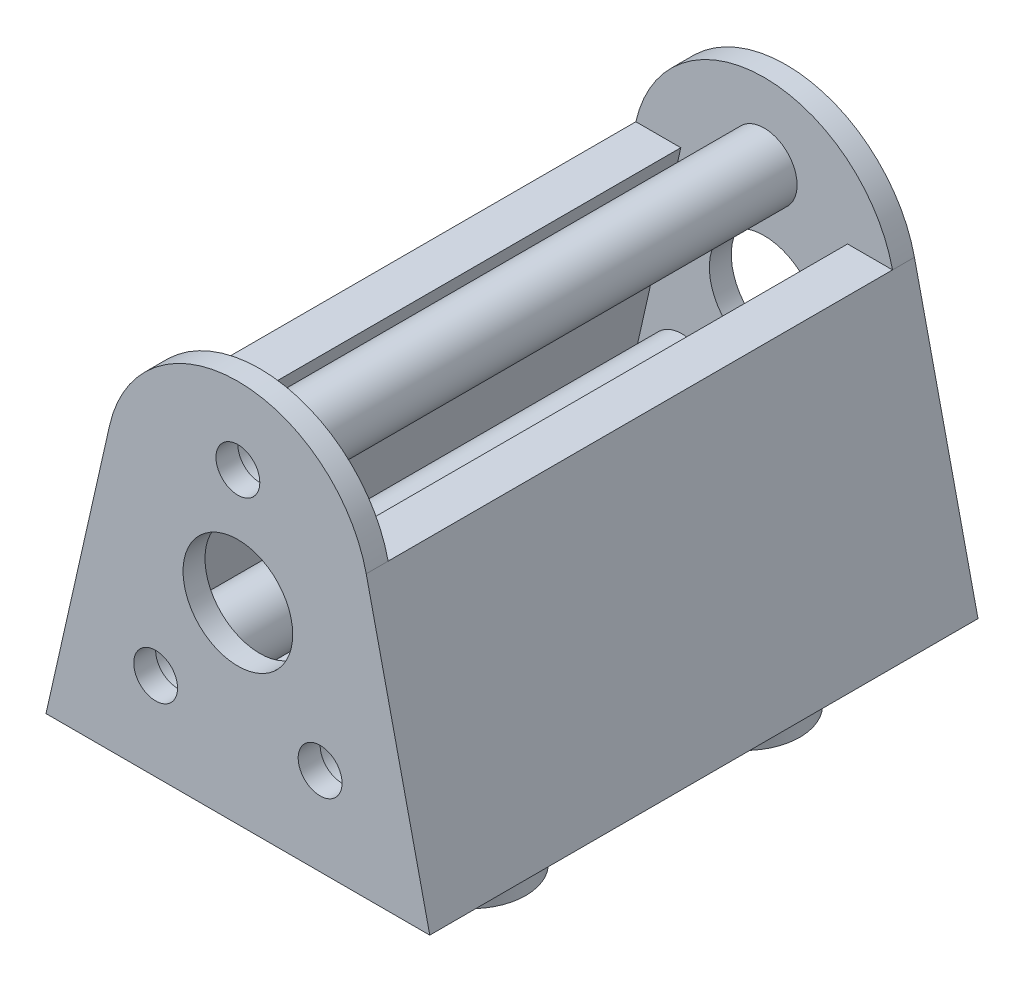
ISO-10303-21;
HEADER;
FILE_DESCRIPTION(('STEP AP214'),'2;1');
FILE_NAME('part.step','',(''),(''),'','','');
FILE_SCHEMA(('AUTOMOTIVE_DESIGN { 1 0 10303 214 1 1 1 1 }'));
ENDSEC;
DATA;
#1=APPLICATION_CONTEXT('core data for automotive mechanical design processes');
#2=APPLICATION_PROTOCOL_DEFINITION('international standard','automotive_design',2000,#1);
#3=PRODUCT_CONTEXT('',#1,'mechanical');
#4=PRODUCT('Part','Part','',(#3));
#5=PRODUCT_RELATED_PRODUCT_CATEGORY('part','',(#4));
#6=PRODUCT_DEFINITION_FORMATION('','',#4);
#7=PRODUCT_DEFINITION_CONTEXT('part definition',#1,'design');
#8=PRODUCT_DEFINITION('design','',#6,#7);
#9=PRODUCT_DEFINITION_SHAPE('','',#8);
#10=(LENGTH_UNIT() NAMED_UNIT(*) SI_UNIT(.MILLI.,.METRE.));
#11=(NAMED_UNIT(*) PLANE_ANGLE_UNIT() SI_UNIT($,.RADIAN.));
#12=(NAMED_UNIT(*) SI_UNIT($,.STERADIAN.) SOLID_ANGLE_UNIT());
#13=UNCERTAINTY_MEASURE_WITH_UNIT(LENGTH_MEASURE(1.E-05),#10,'distance_accuracy_value','');
#14=(GEOMETRIC_REPRESENTATION_CONTEXT(3) GLOBAL_UNCERTAINTY_ASSIGNED_CONTEXT((#13)) GLOBAL_UNIT_ASSIGNED_CONTEXT((#10,
#11,#12)) REPRESENTATION_CONTEXT('',''));
#15=CARTESIAN_POINT('',(0.,0.,0.));
#16=DIRECTION('',(0.,0.,1.));
#17=DIRECTION('',(1.,0.,0.));
#18=AXIS2_PLACEMENT_3D('',#15,#16,#17);
#19=CARTESIAN_POINT('',(0.,0.,0.));
#20=DIRECTION('',(0.,0.,1.));
#21=DIRECTION('',(1.,0.,0.));
#22=AXIS2_PLACEMENT_3D('',#19,#20,#21);
#23=PLANE('',#22);
#24=CARTESIAN_POINT('',(7.5,8.,0.));
#25=DIRECTION('',(0.,0.,1.));
#26=DIRECTION('',(1.,0.,0.));
#27=AXIS2_PLACEMENT_3D('',#24,#25,#26);
#28=CIRCLE('',#27,2.);
#29=CARTESIAN_POINT('',(9.5,8.,0.));
#30=VERTEX_POINT('',#29);
#31=EDGE_CURVE('E134',#30,#30,#28,.T.);
#32=ORIENTED_EDGE('',*,*,#31,.T.);
#33=EDGE_LOOP('',(#32));
#34=FACE_BOUND('',#33,.T.);
#35=CARTESIAN_POINT('',(7.5,8.,0.));
#36=DIRECTION('',(0.,0.,-1.));
#37=DIRECTION('',(1.,0.,0.));
#38=AXIS2_PLACEMENT_3D('',#35,#36,#37);
#39=CIRCLE('',#38,2.5);
#40=CARTESIAN_POINT('',(10.,8.,0.));
#41=VERTEX_POINT('',#40);
#42=EDGE_CURVE('E178',#41,#41,#39,.T.);
#43=ORIENTED_EDGE('',*,*,#42,.T.);
#44=EDGE_LOOP('',(#43));
#45=FACE_BOUND('',#44,.T.);
#46=ADVANCED_FACE('F48',(#34,#45),#23,.F.);
#47=CARTESIAN_POINT('',(0.,23.,-46.));
#48=DIRECTION('',(0.,0.,1.));
#49=DIRECTION('',(1.,0.,0.));
#50=AXIS2_PLACEMENT_3D('',#47,#48,#49);
#51=PLANE('',#50);
#52=CARTESIAN_POINT('',(7.5,8.,-46.));
#53=DIRECTION('',(0.,0.,1.));
#54=DIRECTION('',(1.,0.,0.));
#55=AXIS2_PLACEMENT_3D('',#52,#53,#54);
#56=CIRCLE('',#55,2.);
#57=CARTESIAN_POINT('',(9.5,8.,-46.));
#58=VERTEX_POINT('',#57);
#59=EDGE_CURVE('E203',#58,#58,#56,.T.);
#60=ORIENTED_EDGE('',*,*,#59,.F.);
#61=EDGE_LOOP('',(#60));
#62=FACE_BOUND('',#61,.T.);
#63=CARTESIAN_POINT('',(7.5,8.,-46.));
#64=DIRECTION('',(0.,0.,1.));
#65=DIRECTION('',(1.,0.,0.));
#66=AXIS2_PLACEMENT_3D('',#63,#64,#65);
#67=CIRCLE('',#66,2.5);
#68=CARTESIAN_POINT('',(10.,8.,-46.));
#69=VERTEX_POINT('',#68);
#70=EDGE_CURVE('E282',#69,#69,#67,.F.);
#71=ORIENTED_EDGE('',*,*,#70,.F.);
#72=EDGE_LOOP('',(#71));
#73=FACE_BOUND('',#72,.T.);
#74=ADVANCED_FACE('F360',(#62,#73),#51,.T.);
#75=CARTESIAN_POINT('',(0.,28.,0.));
#76=DIRECTION('',(0.,0.,1.));
#77=DIRECTION('',(1.,0.,0.));
#78=AXIS2_PLACEMENT_3D('',#75,#76,#77);
#79=CIRCLE('',#78,2.);
#80=CARTESIAN_POINT('',(2.,28.,0.));
#81=VERTEX_POINT('',#80);
#82=EDGE_CURVE('E265',#81,#81,#79,.T.);
#83=ORIENTED_EDGE('',*,*,#82,.T.);
#84=EDGE_LOOP('',(#83));
#85=FACE_BOUND('',#84,.T.);
#86=CARTESIAN_POINT('',(0.,28.,0.));
#87=DIRECTION('',(0.,0.,-1.));
#88=DIRECTION('',(-1.,0.,0.));
#89=AXIS2_PLACEMENT_3D('',#86,#87,#88);
#90=CIRCLE('',#89,2.5);
#91=CARTESIAN_POINT('',(-2.5,28.,0.));
#92=VERTEX_POINT('',#91);
#93=EDGE_CURVE('E184',#92,#92,#90,.T.);
#94=ORIENTED_EDGE('',*,*,#93,.T.);
#95=EDGE_LOOP('',(#94));
#96=FACE_BOUND('',#95,.T.);
#97=ADVANCED_FACE('F395',(#85,#96),#23,.F.);
#98=CARTESIAN_POINT('',(0.,28.,-46.));
#99=DIRECTION('',(0.,0.,1.));
#100=DIRECTION('',(1.,0.,0.));
#101=AXIS2_PLACEMENT_3D('',#98,#99,#100);
#102=CIRCLE('',#101,2.);
#103=CARTESIAN_POINT('',(2.,28.,-46.));
#104=VERTEX_POINT('',#103);
#105=EDGE_CURVE('E191',#104,#104,#102,.T.);
#106=ORIENTED_EDGE('',*,*,#105,.F.);
#107=EDGE_LOOP('',(#106));
#108=FACE_BOUND('',#107,.T.);
#109=CARTESIAN_POINT('',(0.,28.,-46.));
#110=DIRECTION('',(0.,0.,1.));
#111=DIRECTION('',(1.,0.,0.));
#112=AXIS2_PLACEMENT_3D('',#109,#110,#111);
#113=CIRCLE('',#112,2.5);
#114=CARTESIAN_POINT('',(2.5,28.,-46.));
#115=VERTEX_POINT('',#114);
#116=EDGE_CURVE('E276',#115,#115,#113,.F.);
#117=ORIENTED_EDGE('',*,*,#116,.F.);
#118=EDGE_LOOP('',(#117));
#119=FACE_BOUND('',#118,.T.);
#120=ADVANCED_FACE('F400',(#108,#119),#51,.T.);
#121=CARTESIAN_POINT('',(-7.5,8.,0.));
#122=DIRECTION('',(0.,0.,1.));
#123=DIRECTION('',(1.,0.,0.));
#124=AXIS2_PLACEMENT_3D('',#121,#122,#123);
#125=CIRCLE('',#124,2.);
#126=CARTESIAN_POINT('',(-5.5,8.,0.));
#127=VERTEX_POINT('',#126);
#128=EDGE_CURVE('E245',#127,#127,#125,.T.);
#129=ORIENTED_EDGE('',*,*,#128,.T.);
#130=EDGE_LOOP('',(#129));
#131=FACE_BOUND('',#130,.T.);
#132=CARTESIAN_POINT('',(-7.5,8.,0.));
#133=DIRECTION('',(0.,0.,-1.));
#134=DIRECTION('',(-1.,0.,0.));
#135=AXIS2_PLACEMENT_3D('',#132,#133,#134);
#136=CIRCLE('',#135,2.5);
#137=CARTESIAN_POINT('',(-10.,8.,0.));
#138=VERTEX_POINT('',#137);
#139=EDGE_CURVE('E233',#138,#138,#136,.T.);
#140=ORIENTED_EDGE('',*,*,#139,.T.);
#141=EDGE_LOOP('',(#140));
#142=FACE_BOUND('',#141,.T.);
#143=ADVANCED_FACE('F406',(#131,#142),#23,.F.);
#144=CARTESIAN_POINT('',(0.,23.,2.));
#145=DIRECTION('',(0.,0.,-1.));
#146=DIRECTION('',(-1.,0.,0.));
#147=AXIS2_PLACEMENT_3D('',#144,#145,#146);
#148=CYLINDRICAL_SURFACE('',#147,12.);
#149=CARTESIAN_POINT('',(0.,23.,0.));
#150=DIRECTION('',(0.,0.,1.));
#151=DIRECTION('',(1.,0.,0.));
#152=AXIS2_PLACEMENT_3D('',#149,#150,#151);
#153=CIRCLE('',#152,12.);
#154=CARTESIAN_POINT('',(11.704867868871,25.6450081610975,0.));
#155=VERTEX_POINT('',#154);
#156=CARTESIAN_POINT('',(-11.704867868871,25.6450081610975,0.));
#157=VERTEX_POINT('',#156);
#158=EDGE_CURVE('E124',#155,#157,#153,.T.);
#159=ORIENTED_EDGE('',*,*,#158,.T.);
#160=DIRECTION('',(0.,0.,-1.));
#161=VECTOR('',#160,1.);
#162=CARTESIAN_POINT('',(-11.704867868871,25.6450081610975,2.));
#163=LINE('',#162,#161);
#164=CARTESIAN_POINT('',(-11.704867868871,25.6450081610975,2.));
#165=VERTEX_POINT('',#164);
#166=EDGE_CURVE('E128',#165,#157,#163,.T.);
#167=ORIENTED_EDGE('',*,*,#166,.F.);
#168=CARTESIAN_POINT('',(0.,23.,2.));
#169=DIRECTION('',(0.,0.,1.));
#170=DIRECTION('',(1.,0.,0.));
#171=AXIS2_PLACEMENT_3D('',#168,#169,#170);
#172=CIRCLE('',#171,12.);
#173=CARTESIAN_POINT('',(11.704867868871,25.6450081610975,2.));
#174=VERTEX_POINT('',#173);
#175=EDGE_CURVE('E244',#174,#165,#172,.T.);
#176=ORIENTED_EDGE('',*,*,#175,.F.);
#177=DIRECTION('',(0.,0.,-1.));
#178=VECTOR('',#177,1.);
#179=CARTESIAN_POINT('',(11.704867868871,25.6450081610975,2.));
#180=LINE('',#179,#178);
#181=EDGE_CURVE('E131',#174,#155,#180,.T.);
#182=ORIENTED_EDGE('',*,*,#181,.T.);
#183=EDGE_LOOP('',(#159,#167,#176,#182));
#184=FACE_BOUND('',#183,.T.);
#185=ADVANCED_FACE('F126',(#184),#148,.T.);
#186=CARTESIAN_POINT('',(-16.6497833818419,3.76243571639095,2.));
#187=DIRECTION('',(-0.975405655739247,0.220417346758122,0.));
#188=DIRECTION('',(-0.220417346758122,-0.975405655739247,0.));
#189=AXIS2_PLACEMENT_3D('',#186,#187,#188);
#190=PLANE('',#189);
#191=ORIENTED_EDGE('',*,*,#166,.T.);
#192=DIRECTION('',(0.,0.,1.));
#193=VECTOR('',#192,1.);
#194=CARTESIAN_POINT('',(-11.704867868871,25.6450081610975,-91.389704350027));
#195=LINE('',#194,#193);
#196=CARTESIAN_POINT('',(-11.704867868871,25.6450081610975,-46.));
#197=VERTEX_POINT('',#196);
#198=EDGE_CURVE('E142',#197,#157,#195,.T.);
#199=ORIENTED_EDGE('',*,*,#198,.F.);
#200=DIRECTION('',(0.,0.,-1.));
#201=VECTOR('',#200,1.);
#202=CARTESIAN_POINT('',(-11.704867868871,25.6450081610975,-46.));
#203=LINE('',#202,#201);
#204=CARTESIAN_POINT('',(-11.704867868871,25.6450081610975,-48.));
#205=VERTEX_POINT('',#204);
#206=EDGE_CURVE('E230',#197,#205,#203,.T.);
#207=ORIENTED_EDGE('',*,*,#206,.T.);
#208=DIRECTION('',(-0.220417346758122,-0.975405655739247,0.));
#209=VECTOR('',#208,1.);
#210=CARTESIAN_POINT('',(-11.704867868871,25.6450081610975,-48.));
#211=LINE('',#210,#209);
#212=CARTESIAN_POINT('',(-17.5,0.,-48.));
#213=VERTEX_POINT('',#212);
#214=EDGE_CURVE('E221',#205,#213,#211,.T.);
#215=ORIENTED_EDGE('',*,*,#214,.T.);
#216=DIRECTION('',(0.,0.,-1.));
#217=VECTOR('',#216,1.);
#218=CARTESIAN_POINT('',(-17.5,0.,2.));
#219=LINE('',#218,#217);
#220=CARTESIAN_POINT('',(-17.5,0.,2.));
#221=VERTEX_POINT('',#220);
#222=EDGE_CURVE('E146',#221,#213,#219,.T.);
#223=ORIENTED_EDGE('',*,*,#222,.F.);
#224=DIRECTION('',(0.220417346758122,0.975405655739247,0.));
#225=VECTOR('',#224,1.);
#226=CARTESIAN_POINT('',(-16.6497833818419,3.76243571639095,2.));
#227=LINE('',#226,#225);
#228=EDGE_CURVE('E144',#221,#165,#227,.T.);
#229=ORIENTED_EDGE('',*,*,#228,.T.);
#230=EDGE_LOOP('',(#191,#199,#207,#215,#223,#229));
#231=FACE_BOUND('',#230,.T.);
#232=ADVANCED_FACE('F139',(#231),#190,.T.);
#233=CARTESIAN_POINT('',(0.,0.,2.));
#234=DIRECTION('',(0.,1.,0.));
#235=DIRECTION('',(0.,0.,1.));
#236=AXIS2_PLACEMENT_3D('',#233,#234,#235);
#237=PLANE('',#236);
#238=CARTESIAN_POINT('',(-8.75,0.,-10.5));
#239=DIRECTION('',(0.,1.,0.));
#240=DIRECTION('',(0.,0.,1.));
#241=AXIS2_PLACEMENT_3D('',#238,#239,#240);
#242=CIRCLE('',#241,5.);
#243=CARTESIAN_POINT('',(-8.75,0.,-5.5));
#244=VERTEX_POINT('',#243);
#245=EDGE_CURVE('E13',#244,#244,#242,.F.);
#246=ORIENTED_EDGE('',*,*,#245,.F.);
#247=EDGE_LOOP('',(#246));
#248=FACE_BOUND('',#247,.T.);
#249=CARTESIAN_POINT('',(-8.75,0.,-35.5));
#250=DIRECTION('',(0.,1.,0.));
#251=DIRECTION('',(0.,0.,1.));
#252=AXIS2_PLACEMENT_3D('',#249,#250,#251);
#253=CIRCLE('',#252,5.);
#254=CARTESIAN_POINT('',(-8.75,0.,-30.5));
#255=VERTEX_POINT('',#254);
#256=EDGE_CURVE('E56',#255,#255,#253,.F.);
#257=ORIENTED_EDGE('',*,*,#256,.F.);
#258=EDGE_LOOP('',(#257));
#259=FACE_BOUND('',#258,.T.);
#260=CARTESIAN_POINT('',(8.75,0.,-35.5));
#261=DIRECTION('',(0.,1.,0.));
#262=DIRECTION('',(0.,0.,1.));
#263=AXIS2_PLACEMENT_3D('',#260,#261,#262);
#264=CIRCLE('',#263,5.);
#265=CARTESIAN_POINT('',(8.75,0.,-30.5));
#266=VERTEX_POINT('',#265);
#267=EDGE_CURVE('E291',#266,#266,#264,.F.);
#268=ORIENTED_EDGE('',*,*,#267,.F.);
#269=EDGE_LOOP('',(#268));
#270=FACE_BOUND('',#269,.T.);
#271=CARTESIAN_POINT('',(8.75,0.,-10.5));
#272=DIRECTION('',(0.,1.,0.));
#273=DIRECTION('',(0.,0.,1.));
#274=AXIS2_PLACEMENT_3D('',#271,#272,#273);
#275=CIRCLE('',#274,5.);
#276=CARTESIAN_POINT('',(8.75,0.,-5.5));
#277=VERTEX_POINT('',#276);
#278=EDGE_CURVE('E288',#277,#277,#275,.F.);
#279=ORIENTED_EDGE('',*,*,#278,.F.);
#280=EDGE_LOOP('',(#279));
#281=FACE_BOUND('',#280,.T.);
#282=ORIENTED_EDGE('',*,*,#222,.T.);
#283=DIRECTION('',(1.,0.,0.));
#284=VECTOR('',#283,1.);
#285=CARTESIAN_POINT('',(-17.5,0.,-48.));
#286=LINE('',#285,#284);
#287=CARTESIAN_POINT('',(17.5,0.,-48.));
#288=VERTEX_POINT('',#287);
#289=EDGE_CURVE('E224',#213,#288,#286,.T.);
#290=ORIENTED_EDGE('',*,*,#289,.T.);
#291=DIRECTION('',(0.,0.,-1.));
#292=VECTOR('',#291,1.);
#293=CARTESIAN_POINT('',(17.5,0.,2.));
#294=LINE('',#293,#292);
#295=CARTESIAN_POINT('',(17.5,0.,2.));
#296=VERTEX_POINT('',#295);
#297=EDGE_CURVE('E271',#296,#288,#294,.T.);
#298=ORIENTED_EDGE('',*,*,#297,.F.);
#299=DIRECTION('',(1.,0.,0.));
#300=VECTOR('',#299,1.);
#301=CARTESIAN_POINT('',(0.,0.,2.));
#302=LINE('',#301,#300);
#303=EDGE_CURVE('E248',#221,#296,#302,.T.);
#304=ORIENTED_EDGE('',*,*,#303,.F.);
#305=EDGE_LOOP('',(#282,#290,#298,#304));
#306=FACE_BOUND('',#305,.T.);
#307=ADVANCED_FACE('F298',(#248,#259,#270,#281,#306),#237,.F.);
#308=CARTESIAN_POINT('',(0.,28.,2.));
#309=DIRECTION('',(0.,0.,-1.));
#310=DIRECTION('',(-1.,0.,0.));
#311=AXIS2_PLACEMENT_3D('',#308,#309,#310);
#312=CYLINDRICAL_SURFACE('',#311,2.);
#313=CARTESIAN_POINT('',(0.,28.,2.));
#314=DIRECTION('',(0.,0.,1.));
#315=DIRECTION('',(1.,0.,0.));
#316=AXIS2_PLACEMENT_3D('',#313,#314,#315);
#317=CIRCLE('',#316,2.);
#318=CARTESIAN_POINT('',(2.,28.,2.));
#319=VERTEX_POINT('',#318);
#320=EDGE_CURVE('E255',#319,#319,#317,.T.);
#321=ORIENTED_EDGE('',*,*,#320,.T.);
#322=EDGE_LOOP('',(#321));
#323=FACE_BOUND('',#322,.T.);
#324=ORIENTED_EDGE('',*,*,#82,.F.);
#325=EDGE_LOOP('',(#324));
#326=FACE_BOUND('',#325,.T.);
#327=ADVANCED_FACE('F301',(#323,#326),#312,.F.);
#328=CARTESIAN_POINT('',(7.5,8.,2.));
#329=DIRECTION('',(0.,0.,-1.));
#330=DIRECTION('',(-1.,0.,0.));
#331=AXIS2_PLACEMENT_3D('',#328,#329,#330);
#332=CYLINDRICAL_SURFACE('',#331,2.);
#333=CARTESIAN_POINT('',(7.5,8.,2.));
#334=DIRECTION('',(0.,0.,1.));
#335=DIRECTION('',(1.,0.,0.));
#336=AXIS2_PLACEMENT_3D('',#333,#334,#335);
#337=CIRCLE('',#336,2.);
#338=CARTESIAN_POINT('',(9.5,8.,2.));
#339=VERTEX_POINT('',#338);
#340=EDGE_CURVE('E252',#339,#339,#337,.T.);
#341=ORIENTED_EDGE('',*,*,#340,.T.);
#342=EDGE_LOOP('',(#341));
#343=FACE_BOUND('',#342,.T.);
#344=ORIENTED_EDGE('',*,*,#31,.F.);
#345=EDGE_LOOP('',(#344));
#346=FACE_BOUND('',#345,.T.);
#347=ADVANCED_FACE('F746',(#343,#346),#332,.F.);
#348=CARTESIAN_POINT('',(16.6497833818419,3.76243571639095,2.));
#349=DIRECTION('',(-0.975405655739247,-0.220417346758122,0.));
#350=DIRECTION('',(0.220417346758122,-0.975405655739247,0.));
#351=AXIS2_PLACEMENT_3D('',#348,#349,#350);
#352=PLANE('',#351);
#353=ORIENTED_EDGE('',*,*,#297,.T.);
#354=DIRECTION('',(-0.220417346758122,0.975405655739247,0.));
#355=VECTOR('',#354,1.);
#356=CARTESIAN_POINT('',(17.5,0.,-48.));
#357=LINE('',#356,#355);
#358=CARTESIAN_POINT('',(11.704867868871,25.6450081610975,-48.));
#359=VERTEX_POINT('',#358);
#360=EDGE_CURVE('E218',#288,#359,#357,.T.);
#361=ORIENTED_EDGE('',*,*,#360,.T.);
#362=DIRECTION('',(0.,0.,-1.));
#363=VECTOR('',#362,1.);
#364=CARTESIAN_POINT('',(11.704867868871,25.6450081610975,-46.));
#365=LINE('',#364,#363);
#366=CARTESIAN_POINT('',(11.704867868871,25.6450081610975,-46.));
#367=VERTEX_POINT('',#366);
#368=EDGE_CURVE('E217',#367,#359,#365,.T.);
#369=ORIENTED_EDGE('',*,*,#368,.F.);
#370=DIRECTION('',(0.,0.,1.));
#371=VECTOR('',#370,1.);
#372=CARTESIAN_POINT('',(11.704867868871,25.6450081610975,-91.389704350027));
#373=LINE('',#372,#371);
#374=EDGE_CURVE('E329',#367,#155,#373,.T.);
#375=ORIENTED_EDGE('',*,*,#374,.T.);
#376=ORIENTED_EDGE('',*,*,#181,.F.);
#377=DIRECTION('',(-0.220417346758122,0.975405655739247,0.));
#378=VECTOR('',#377,1.);
#379=CARTESIAN_POINT('',(16.6497833818419,3.76243571639095,2.));
#380=LINE('',#379,#378);
#381=EDGE_CURVE('E250',#296,#174,#380,.T.);
#382=ORIENTED_EDGE('',*,*,#381,.F.);
#383=EDGE_LOOP('',(#353,#361,#369,#375,#376,#382));
#384=FACE_BOUND('',#383,.T.);
#385=ADVANCED_FACE('F321',(#384),#352,.F.);
#386=CARTESIAN_POINT('',(0.,17.5,2.));
#387=DIRECTION('',(0.,0.,-1.));
#388=DIRECTION('',(-1.,0.,0.));
#389=AXIS2_PLACEMENT_3D('',#386,#387,#388);
#390=CYLINDRICAL_SURFACE('',#389,5.);
#391=CARTESIAN_POINT('',(0.,17.5,2.));
#392=DIRECTION('',(0.,0.,1.));
#393=DIRECTION('',(1.,0.,0.));
#394=AXIS2_PLACEMENT_3D('',#391,#392,#393);
#395=CIRCLE('',#394,5.);
#396=CARTESIAN_POINT('',(5.,17.5,2.));
#397=VERTEX_POINT('',#396);
#398=EDGE_CURVE('E241',#397,#397,#395,.T.);
#399=ORIENTED_EDGE('',*,*,#398,.T.);
#400=EDGE_LOOP('',(#399));
#401=FACE_BOUND('',#400,.T.);
#402=CARTESIAN_POINT('',(0.,17.5,0.));
#403=DIRECTION('',(0.,0.,1.));
#404=DIRECTION('',(1.,0.,0.));
#405=AXIS2_PLACEMENT_3D('',#402,#403,#404);
#406=CIRCLE('',#405,5.);
#407=CARTESIAN_POINT('',(5.,17.5,0.));
#408=VERTEX_POINT('',#407);
#409=EDGE_CURVE('E135',#408,#408,#406,.T.);
#410=ORIENTED_EDGE('',*,*,#409,.F.);
#411=EDGE_LOOP('',(#410));
#412=FACE_BOUND('',#411,.T.);
#413=ADVANCED_FACE('F50',(#401,#412),#390,.F.);
#414=CARTESIAN_POINT('',(-7.5,8.,2.));
#415=DIRECTION('',(0.,0.,-1.));
#416=DIRECTION('',(-1.,0.,0.));
#417=AXIS2_PLACEMENT_3D('',#414,#415,#416);
#418=CYLINDRICAL_SURFACE('',#417,2.);
#419=CARTESIAN_POINT('',(-7.5,8.,2.));
#420=DIRECTION('',(0.,0.,1.));
#421=DIRECTION('',(1.,0.,0.));
#422=AXIS2_PLACEMENT_3D('',#419,#420,#421);
#423=CIRCLE('',#422,2.);
#424=CARTESIAN_POINT('',(-5.5,8.,2.));
#425=VERTEX_POINT('',#424);
#426=EDGE_CURVE('E258',#425,#425,#423,.T.);
#427=ORIENTED_EDGE('',*,*,#426,.T.);
#428=EDGE_LOOP('',(#427));
#429=FACE_BOUND('',#428,.T.);
#430=ORIENTED_EDGE('',*,*,#128,.F.);
#431=EDGE_LOOP('',(#430));
#432=FACE_BOUND('',#431,.T.);
#433=ADVANCED_FACE('F418',(#429,#432),#418,.F.);
#434=CARTESIAN_POINT('',(0.,0.,2.));
#435=DIRECTION('',(0.,0.,1.));
#436=DIRECTION('',(1.,0.,0.));
#437=AXIS2_PLACEMENT_3D('',#434,#435,#436);
#438=PLANE('',#437);
#439=ORIENTED_EDGE('',*,*,#398,.F.);
#440=EDGE_LOOP('',(#439));
#441=FACE_BOUND('',#440,.T.);
#442=ORIENTED_EDGE('',*,*,#175,.T.);
#443=ORIENTED_EDGE('',*,*,#228,.F.);
#444=ORIENTED_EDGE('',*,*,#303,.T.);
#445=ORIENTED_EDGE('',*,*,#381,.T.);
#446=EDGE_LOOP('',(#442,#443,#444,#445));
#447=FACE_BOUND('',#446,.T.);
#448=ORIENTED_EDGE('',*,*,#340,.F.);
#449=EDGE_LOOP('',(#448));
#450=FACE_BOUND('',#449,.T.);
#451=ORIENTED_EDGE('',*,*,#320,.F.);
#452=EDGE_LOOP('',(#451));
#453=FACE_BOUND('',#452,.T.);
#454=ORIENTED_EDGE('',*,*,#426,.F.);
#455=EDGE_LOOP('',(#454));
#456=FACE_BOUND('',#455,.T.);
#457=ADVANCED_FACE('F409',(#441,#447,#450,#453,#456),#438,.T.);
#458=CARTESIAN_POINT('',(7.5,8.,0.));
#459=DIRECTION('',(0.,0.,1.));
#460=DIRECTION('',(1.,0.,0.));
#461=AXIS2_PLACEMENT_3D('',#458,#459,#460);
#462=CIRCLE('',#461,3.);
#463=CARTESIAN_POINT('',(10.5,8.,0.));
#464=VERTEX_POINT('',#463);
#465=EDGE_CURVE('E285',#464,#464,#462,.F.);
#466=ORIENTED_EDGE('',*,*,#465,.F.);
#467=EDGE_LOOP('',(#466));
#468=FACE_BOUND('',#467,.T.);
#469=CARTESIAN_POINT('',(0.,28.,0.));
#470=DIRECTION('',(0.,0.,1.));
#471=DIRECTION('',(1.,0.,0.));
#472=AXIS2_PLACEMENT_3D('',#469,#470,#471);
#473=CIRCLE('',#472,3.);
#474=CARTESIAN_POINT('',(3.,28.,0.));
#475=VERTEX_POINT('',#474);
#476=EDGE_CURVE('E279',#475,#475,#473,.F.);
#477=ORIENTED_EDGE('',*,*,#476,.F.);
#478=EDGE_LOOP('',(#477));
#479=FACE_BOUND('',#478,.T.);
#480=CARTESIAN_POINT('',(-7.5,8.,0.));
#481=DIRECTION('',(0.,0.,1.));
#482=DIRECTION('',(1.,0.,0.));
#483=AXIS2_PLACEMENT_3D('',#480,#481,#482);
#484=CIRCLE('',#483,3.);
#485=CARTESIAN_POINT('',(-4.5,8.,0.));
#486=VERTEX_POINT('',#485);
#487=EDGE_CURVE('E145',#486,#486,#484,.F.);
#488=ORIENTED_EDGE('',*,*,#487,.F.);
#489=EDGE_LOOP('',(#488));
#490=FACE_BOUND('',#489,.T.);
#491=ORIENTED_EDGE('',*,*,#409,.T.);
#492=EDGE_LOOP('',(#491));
#493=FACE_BOUND('',#492,.T.);
#494=ORIENTED_EDGE('',*,*,#158,.F.);
#495=DIRECTION('',(-1.,0.,0.));
#496=VECTOR('',#495,1.);
#497=CARTESIAN_POINT('',(0.,25.6450081610974,0.));
#498=LINE('',#497,#496);
#499=CARTESIAN_POINT('',(7.60400995763765,25.6450081610975,0.));
#500=VERTEX_POINT('',#499);
#501=EDGE_CURVE('E63',#155,#500,#498,.T.);
#502=ORIENTED_EDGE('',*,*,#501,.T.);
#503=DIRECTION('',(-0.220417346758122,0.975405655739247,0.));
#504=VECTOR('',#503,1.);
#505=CARTESIAN_POINT('',(12.7481607588849,2.88076632935846,0.));
#506=LINE('',#505,#504);
#507=CARTESIAN_POINT('',(12.4952418685406,4.00000000000001,0.));
#508=VERTEX_POINT('',#507);
#509=EDGE_CURVE('E68',#508,#500,#506,.T.);
#510=ORIENTED_EDGE('',*,*,#509,.F.);
#511=DIRECTION('',(1.,0.,0.));
#512=VECTOR('',#511,1.);
#513=CARTESIAN_POINT('',(0.,4.00000000000001,0.));
#514=LINE('',#513,#512);
#515=CARTESIAN_POINT('',(-12.4952418685406,4.00000000000001,0.));
#516=VERTEX_POINT('',#515);
#517=EDGE_CURVE('E346',#516,#508,#514,.T.);
#518=ORIENTED_EDGE('',*,*,#517,.F.);
#519=DIRECTION('',(0.220417346758122,0.975405655739247,0.));
#520=VECTOR('',#519,1.);
#521=CARTESIAN_POINT('',(-12.7481607588849,2.88076632935846,0.));
#522=LINE('',#521,#520);
#523=CARTESIAN_POINT('',(-7.60400995763765,25.6450081610975,0.));
#524=VERTEX_POINT('',#523);
#525=EDGE_CURVE('E152',#516,#524,#522,.T.);
#526=ORIENTED_EDGE('',*,*,#525,.T.);
#527=DIRECTION('',(1.,0.,0.));
#528=VECTOR('',#527,1.);
#529=CARTESIAN_POINT('',(0.,25.6450081610975,0.));
#530=LINE('',#529,#528);
#531=EDGE_CURVE('E149',#157,#524,#530,.T.);
#532=ORIENTED_EDGE('',*,*,#531,.F.);
#533=EDGE_LOOP('',(#494,#502,#510,#518,#526,#532));
#534=FACE_BOUND('',#533,.T.);
#535=ADVANCED_FACE('F150',(#468,#479,#490,#493,#534),#23,.F.);
#536=CARTESIAN_POINT('',(-7.5,8.,-54.4852813742386));
#537=DIRECTION('',(0.,0.,1.));
#538=DIRECTION('',(1.,0.,0.));
#539=AXIS2_PLACEMENT_3D('',#536,#537,#538);
#540=CYLINDRICAL_SURFACE('',#539,3.);
#541=CARTESIAN_POINT('',(-7.5,8.,-46.));
#542=DIRECTION('',(0.,0.,1.));
#543=DIRECTION('',(1.,0.,0.));
#544=AXIS2_PLACEMENT_3D('',#541,#542,#543);
#545=CIRCLE('',#544,3.);
#546=CARTESIAN_POINT('',(-4.5,8.,-46.));
#547=VERTEX_POINT('',#546);
#548=EDGE_CURVE('E232',#547,#547,#545,.T.);
#549=ORIENTED_EDGE('',*,*,#548,.T.);
#550=EDGE_LOOP('',(#549));
#551=FACE_BOUND('',#550,.T.);
#552=ORIENTED_EDGE('',*,*,#487,.T.);
#553=EDGE_LOOP('',(#552));
#554=FACE_BOUND('',#553,.T.);
#555=ADVANCED_FACE('F408',(#551,#554),#540,.T.);
#556=CARTESIAN_POINT('',(-7.5,8.,-54.4852813742386));
#557=DIRECTION('',(0.,0.,1.));
#558=DIRECTION('',(1.,0.,0.));
#559=AXIS2_PLACEMENT_3D('',#556,#557,#558);
#560=CYLINDRICAL_SURFACE('',#559,2.5);
#561=CARTESIAN_POINT('',(-7.5,8.,-46.));
#562=DIRECTION('',(0.,0.,1.));
#563=DIRECTION('',(1.,0.,0.));
#564=AXIS2_PLACEMENT_3D('',#561,#562,#563);
#565=CIRCLE('',#564,2.5);
#566=CARTESIAN_POINT('',(-5.,8.,-46.));
#567=VERTEX_POINT('',#566);
#568=EDGE_CURVE('E236',#567,#567,#565,.T.);
#569=ORIENTED_EDGE('',*,*,#568,.F.);
#570=EDGE_LOOP('',(#569));
#571=FACE_BOUND('',#570,.T.);
#572=ORIENTED_EDGE('',*,*,#139,.F.);
#573=EDGE_LOOP('',(#572));
#574=FACE_BOUND('',#573,.T.);
#575=ADVANCED_FACE('F415',(#571,#574),#560,.F.);
#576=CARTESIAN_POINT('',(-7.5,8.,-46.));
#577=DIRECTION('',(0.,0.,1.));
#578=DIRECTION('',(1.,0.,0.));
#579=AXIS2_PLACEMENT_3D('',#576,#577,#578);
#580=CIRCLE('',#579,2.);
#581=CARTESIAN_POINT('',(-5.5,8.,-46.));
#582=VERTEX_POINT('',#581);
#583=EDGE_CURVE('E209',#582,#582,#580,.T.);
#584=ORIENTED_EDGE('',*,*,#583,.F.);
#585=EDGE_LOOP('',(#584));
#586=FACE_BOUND('',#585,.T.);
#587=ORIENTED_EDGE('',*,*,#568,.T.);
#588=EDGE_LOOP('',(#587));
#589=FACE_BOUND('',#588,.T.);
#590=ADVANCED_FACE('F358',(#586,#589),#51,.T.);
#591=DIRECTION('',(-1.,0.,0.));
#592=VECTOR('',#591,1.);
#593=CARTESIAN_POINT('',(0.,25.6450081610974,-46.));
#594=LINE('',#593,#592);
#595=CARTESIAN_POINT('',(7.60400995763765,25.6450081610975,-46.));
#596=VERTEX_POINT('',#595);
#597=EDGE_CURVE('E161',#367,#596,#594,.T.);
#598=ORIENTED_EDGE('',*,*,#597,.F.);
#599=CARTESIAN_POINT('',(0.,23.,-46.));
#600=DIRECTION('',(0.,0.,1.));
#601=DIRECTION('',(1.,0.,0.));
#602=AXIS2_PLACEMENT_3D('',#599,#600,#601);
#603=CIRCLE('',#602,12.);
#604=EDGE_CURVE('E215',#367,#197,#603,.T.);
#605=ORIENTED_EDGE('',*,*,#604,.T.);
#606=DIRECTION('',(1.,0.,0.));
#607=VECTOR('',#606,1.);
#608=CARTESIAN_POINT('',(0.,25.6450081610975,-46.));
#609=LINE('',#608,#607);
#610=CARTESIAN_POINT('',(-7.60400995763765,25.6450081610975,-46.));
#611=VERTEX_POINT('',#610);
#612=EDGE_CURVE('E160',#197,#611,#609,.T.);
#613=ORIENTED_EDGE('',*,*,#612,.T.);
#614=DIRECTION('',(0.220417346758122,0.975405655739247,0.));
#615=VECTOR('',#614,1.);
#616=CARTESIAN_POINT('',(-7.80324524591397,24.763338774065,-46.));
#617=LINE('',#616,#615);
#618=CARTESIAN_POINT('',(-12.4952418685406,4.00000000000001,-46.));
#619=VERTEX_POINT('',#618);
#620=EDGE_CURVE('E171',#619,#611,#617,.T.);
#621=ORIENTED_EDGE('',*,*,#620,.F.);
#622=DIRECTION('',(1.,0.,0.));
#623=VECTOR('',#622,1.);
#624=CARTESIAN_POINT('',(0.,4.00000000000001,-46.));
#625=LINE('',#624,#623);
#626=CARTESIAN_POINT('',(12.4952418685406,4.00000000000001,-46.));
#627=VERTEX_POINT('',#626);
#628=EDGE_CURVE('E174',#619,#627,#625,.T.);
#629=ORIENTED_EDGE('',*,*,#628,.T.);
#630=DIRECTION('',(-0.220417346758122,0.975405655739247,0.));
#631=VECTOR('',#630,1.);
#632=CARTESIAN_POINT('',(7.80324524591397,24.763338774065,-46.));
#633=LINE('',#632,#631);
#634=EDGE_CURVE('E176',#627,#596,#633,.T.);
#635=ORIENTED_EDGE('',*,*,#634,.T.);
#636=EDGE_LOOP('',(#598,#605,#613,#621,#629,#635));
#637=FACE_BOUND('',#636,.T.);
#638=CARTESIAN_POINT('',(7.5,8.,-46.));
#639=DIRECTION('',(0.,0.,1.));
#640=DIRECTION('',(1.,0.,0.));
#641=AXIS2_PLACEMENT_3D('',#638,#639,#640);
#642=CIRCLE('',#641,3.);
#643=CARTESIAN_POINT('',(10.5,8.,-46.));
#644=VERTEX_POINT('',#643);
#645=EDGE_CURVE('E181',#644,#644,#642,.T.);
#646=ORIENTED_EDGE('',*,*,#645,.F.);
#647=EDGE_LOOP('',(#646));
#648=FACE_BOUND('',#647,.T.);
#649=CARTESIAN_POINT('',(0.,28.,-46.));
#650=DIRECTION('',(0.,0.,1.));
#651=DIRECTION('',(1.,0.,0.));
#652=AXIS2_PLACEMENT_3D('',#649,#650,#651);
#653=CIRCLE('',#652,3.);
#654=CARTESIAN_POINT('',(3.,28.,-46.));
#655=VERTEX_POINT('',#654);
#656=EDGE_CURVE('E187',#655,#655,#653,.T.);
#657=ORIENTED_EDGE('',*,*,#656,.F.);
#658=EDGE_LOOP('',(#657));
#659=FACE_BOUND('',#658,.T.);
#660=ORIENTED_EDGE('',*,*,#548,.F.);
#661=EDGE_LOOP('',(#660));
#662=FACE_BOUND('',#661,.T.);
#663=CARTESIAN_POINT('',(0.,17.5,-46.));
#664=DIRECTION('',(0.,0.,1.));
#665=DIRECTION('',(1.,0.,0.));
#666=AXIS2_PLACEMENT_3D('',#663,#664,#665);
#667=CIRCLE('',#666,5.);
#668=CARTESIAN_POINT('',(5.,17.5,-46.));
#669=VERTEX_POINT('',#668);
#670=EDGE_CURVE('E197',#669,#669,#667,.T.);
#671=ORIENTED_EDGE('',*,*,#670,.F.);
#672=EDGE_LOOP('',(#671));
#673=FACE_BOUND('',#672,.T.);
#674=ADVANCED_FACE('F355',(#637,#648,#659,#662,#673),#51,.T.);
#675=CARTESIAN_POINT('',(0.,23.,-48.));
#676=DIRECTION('',(0.,0.,1.));
#677=DIRECTION('',(1.,0.,0.));
#678=AXIS2_PLACEMENT_3D('',#675,#676,#677);
#679=PLANE('',#678);
#680=CARTESIAN_POINT('',(0.,23.,-48.));
#681=DIRECTION('',(0.,0.,1.));
#682=DIRECTION('',(1.,0.,0.));
#683=AXIS2_PLACEMENT_3D('',#680,#681,#682);
#684=CIRCLE('',#683,12.);
#685=EDGE_CURVE('E212',#359,#205,#684,.T.);
#686=ORIENTED_EDGE('',*,*,#685,.F.);
#687=ORIENTED_EDGE('',*,*,#360,.F.);
#688=ORIENTED_EDGE('',*,*,#289,.F.);
#689=ORIENTED_EDGE('',*,*,#214,.F.);
#690=EDGE_LOOP('',(#686,#687,#688,#689));
#691=FACE_BOUND('',#690,.T.);
#692=CARTESIAN_POINT('',(-7.5,8.,-48.));
#693=DIRECTION('',(0.,0.,1.));
#694=DIRECTION('',(1.,0.,0.));
#695=AXIS2_PLACEMENT_3D('',#692,#693,#694);
#696=CIRCLE('',#695,2.);
#697=CARTESIAN_POINT('',(-5.5,8.,-48.));
#698=VERTEX_POINT('',#697);
#699=EDGE_CURVE('E206',#698,#698,#696,.T.);
#700=ORIENTED_EDGE('',*,*,#699,.T.);
#701=EDGE_LOOP('',(#700));
#702=FACE_BOUND('',#701,.T.);
#703=CARTESIAN_POINT('',(7.5,8.,-48.));
#704=DIRECTION('',(0.,0.,1.));
#705=DIRECTION('',(1.,0.,0.));
#706=AXIS2_PLACEMENT_3D('',#703,#704,#705);
#707=CIRCLE('',#706,2.);
#708=CARTESIAN_POINT('',(9.5,8.,-48.));
#709=VERTEX_POINT('',#708);
#710=EDGE_CURVE('E200',#709,#709,#707,.T.);
#711=ORIENTED_EDGE('',*,*,#710,.T.);
#712=EDGE_LOOP('',(#711));
#713=FACE_BOUND('',#712,.T.);
#714=CARTESIAN_POINT('',(0.,17.5,-48.));
#715=DIRECTION('',(0.,0.,1.));
#716=DIRECTION('',(1.,0.,0.));
#717=AXIS2_PLACEMENT_3D('',#714,#715,#716);
#718=CIRCLE('',#717,5.);
#719=CARTESIAN_POINT('',(5.,17.5,-48.));
#720=VERTEX_POINT('',#719);
#721=EDGE_CURVE('E194',#720,#720,#718,.T.);
#722=ORIENTED_EDGE('',*,*,#721,.T.);
#723=EDGE_LOOP('',(#722));
#724=FACE_BOUND('',#723,.T.);
#725=CARTESIAN_POINT('',(0.,28.,-48.));
#726=DIRECTION('',(0.,0.,1.));
#727=DIRECTION('',(1.,0.,0.));
#728=AXIS2_PLACEMENT_3D('',#725,#726,#727);
#729=CIRCLE('',#728,2.);
#730=CARTESIAN_POINT('',(2.,28.,-48.));
#731=VERTEX_POINT('',#730);
#732=EDGE_CURVE('E190',#731,#731,#729,.T.);
#733=ORIENTED_EDGE('',*,*,#732,.T.);
#734=EDGE_LOOP('',(#733));
#735=FACE_BOUND('',#734,.T.);
#736=ADVANCED_FACE('F317',(#691,#702,#713,#724,#735),#679,.F.);
#737=CARTESIAN_POINT('',(0.,23.,-46.));
#738=DIRECTION('',(0.,0.,-1.));
#739=DIRECTION('',(-1.,0.,0.));
#740=AXIS2_PLACEMENT_3D('',#737,#738,#739);
#741=CYLINDRICAL_SURFACE('',#740,12.);
#742=ORIENTED_EDGE('',*,*,#685,.T.);
#743=ORIENTED_EDGE('',*,*,#206,.F.);
#744=ORIENTED_EDGE('',*,*,#604,.F.);
#745=ORIENTED_EDGE('',*,*,#368,.T.);
#746=EDGE_LOOP('',(#742,#743,#744,#745));
#747=FACE_BOUND('',#746,.T.);
#748=ADVANCED_FACE('F325',(#747),#741,.T.);
#749=CARTESIAN_POINT('',(-7.5,8.,-46.));
#750=DIRECTION('',(0.,0.,-1.));
#751=DIRECTION('',(-1.,0.,0.));
#752=AXIS2_PLACEMENT_3D('',#749,#750,#751);
#753=CYLINDRICAL_SURFACE('',#752,2.);
#754=ORIENTED_EDGE('',*,*,#583,.T.);
#755=EDGE_LOOP('',(#754));
#756=FACE_BOUND('',#755,.T.);
#757=ORIENTED_EDGE('',*,*,#699,.F.);
#758=EDGE_LOOP('',(#757));
#759=FACE_BOUND('',#758,.T.);
#760=ADVANCED_FACE('F443',(#756,#759),#753,.F.);
#761=CARTESIAN_POINT('',(7.5,8.,-46.));
#762=DIRECTION('',(0.,0.,-1.));
#763=DIRECTION('',(-1.,0.,0.));
#764=AXIS2_PLACEMENT_3D('',#761,#762,#763);
#765=CYLINDRICAL_SURFACE('',#764,2.);
#766=ORIENTED_EDGE('',*,*,#59,.T.);
#767=EDGE_LOOP('',(#766));
#768=FACE_BOUND('',#767,.T.);
#769=ORIENTED_EDGE('',*,*,#710,.F.);
#770=EDGE_LOOP('',(#769));
#771=FACE_BOUND('',#770,.T.);
#772=ADVANCED_FACE('F373',(#768,#771),#765,.F.);
#773=CARTESIAN_POINT('',(0.,17.5,-46.));
#774=DIRECTION('',(0.,0.,-1.));
#775=DIRECTION('',(-1.,0.,0.));
#776=AXIS2_PLACEMENT_3D('',#773,#774,#775);
#777=CYLINDRICAL_SURFACE('',#776,5.);
#778=ORIENTED_EDGE('',*,*,#670,.T.);
#779=EDGE_LOOP('',(#778));
#780=FACE_BOUND('',#779,.T.);
#781=ORIENTED_EDGE('',*,*,#721,.F.);
#782=EDGE_LOOP('',(#781));
#783=FACE_BOUND('',#782,.T.);
#784=ADVANCED_FACE('F369',(#780,#783),#777,.F.);
#785=CARTESIAN_POINT('',(0.,28.,-46.));
#786=DIRECTION('',(0.,0.,-1.));
#787=DIRECTION('',(-1.,0.,0.));
#788=AXIS2_PLACEMENT_3D('',#785,#786,#787);
#789=CYLINDRICAL_SURFACE('',#788,2.);
#790=ORIENTED_EDGE('',*,*,#105,.T.);
#791=EDGE_LOOP('',(#790));
#792=FACE_BOUND('',#791,.T.);
#793=ORIENTED_EDGE('',*,*,#732,.F.);
#794=EDGE_LOOP('',(#793));
#795=FACE_BOUND('',#794,.T.);
#796=ADVANCED_FACE('F372',(#792,#795),#789,.F.);
#797=CARTESIAN_POINT('',(0.,28.,-54.4852813742386));
#798=DIRECTION('',(0.,0.,1.));
#799=DIRECTION('',(1.,0.,0.));
#800=AXIS2_PLACEMENT_3D('',#797,#798,#799);
#801=CYLINDRICAL_SURFACE('',#800,2.5);
#802=ORIENTED_EDGE('',*,*,#116,.T.);
#803=EDGE_LOOP('',(#802));
#804=FACE_BOUND('',#803,.T.);
#805=ORIENTED_EDGE('',*,*,#93,.F.);
#806=EDGE_LOOP('',(#805));
#807=FACE_BOUND('',#806,.T.);
#808=ADVANCED_FACE('F383',(#804,#807),#801,.F.);
#809=CARTESIAN_POINT('',(0.,28.,-54.4852813742386));
#810=DIRECTION('',(0.,0.,1.));
#811=DIRECTION('',(1.,0.,0.));
#812=AXIS2_PLACEMENT_3D('',#809,#810,#811);
#813=CYLINDRICAL_SURFACE('',#812,3.);
#814=ORIENTED_EDGE('',*,*,#656,.T.);
#815=EDGE_LOOP('',(#814));
#816=FACE_BOUND('',#815,.T.);
#817=ORIENTED_EDGE('',*,*,#476,.T.);
#818=EDGE_LOOP('',(#817));
#819=FACE_BOUND('',#818,.T.);
#820=ADVANCED_FACE('F389',(#816,#819),#813,.T.);
#821=CARTESIAN_POINT('',(7.5,8.,-54.4852813742386));
#822=DIRECTION('',(0.,0.,1.));
#823=DIRECTION('',(1.,0.,0.));
#824=AXIS2_PLACEMENT_3D('',#821,#822,#823);
#825=CYLINDRICAL_SURFACE('',#824,2.5);
#826=ORIENTED_EDGE('',*,*,#70,.T.);
#827=EDGE_LOOP('',(#826));
#828=FACE_BOUND('',#827,.T.);
#829=ORIENTED_EDGE('',*,*,#42,.F.);
#830=EDGE_LOOP('',(#829));
#831=FACE_BOUND('',#830,.T.);
#832=ADVANCED_FACE('F459',(#828,#831),#825,.F.);
#833=CARTESIAN_POINT('',(7.5,8.,-54.4852813742386));
#834=DIRECTION('',(0.,0.,1.));
#835=DIRECTION('',(1.,0.,0.));
#836=AXIS2_PLACEMENT_3D('',#833,#834,#835);
#837=CYLINDRICAL_SURFACE('',#836,3.);
#838=ORIENTED_EDGE('',*,*,#645,.T.);
#839=EDGE_LOOP('',(#838));
#840=FACE_BOUND('',#839,.T.);
#841=ORIENTED_EDGE('',*,*,#465,.T.);
#842=EDGE_LOOP('',(#841));
#843=FACE_BOUND('',#842,.T.);
#844=ADVANCED_FACE('F462',(#840,#843),#837,.T.);
#845=CARTESIAN_POINT('',(0.,25.6450081610974,-91.389704350027));
#846=DIRECTION('',(0.,1.,0.));
#847=DIRECTION('',(-1.,0.,0.));
#848=AXIS2_PLACEMENT_3D('',#845,#846,#847);
#849=PLANE('',#848);
#850=ORIENTED_EDGE('',*,*,#374,.F.);
#851=ORIENTED_EDGE('',*,*,#597,.T.);
#852=DIRECTION('',(0.,0.,1.));
#853=VECTOR('',#852,1.);
#854=CARTESIAN_POINT('',(7.60400995763765,25.6450081610975,-91.389704350027));
#855=LINE('',#854,#853);
#856=EDGE_CURVE('E332',#596,#500,#855,.T.);
#857=ORIENTED_EDGE('',*,*,#856,.T.);
#858=ORIENTED_EDGE('',*,*,#501,.F.);
#859=EDGE_LOOP('',(#850,#851,#857,#858));
#860=FACE_BOUND('',#859,.T.);
#861=ADVANCED_FACE('F330',(#860),#849,.T.);
#862=CARTESIAN_POINT('',(12.7481607588849,2.88076632935846,-91.389704350027));
#863=DIRECTION('',(0.975405655739247,0.220417346758122,0.));
#864=DIRECTION('',(-0.220417346758122,0.975405655739247,0.));
#865=AXIS2_PLACEMENT_3D('',#862,#863,#864);
#866=PLANE('',#865);
#867=ORIENTED_EDGE('',*,*,#634,.F.);
#868=DIRECTION('',(0.,0.,1.));
#869=VECTOR('',#868,1.);
#870=CARTESIAN_POINT('',(12.4952418685406,4.00000000000001,-91.389704350027));
#871=LINE('',#870,#869);
#872=EDGE_CURVE('E334',#627,#508,#871,.T.);
#873=ORIENTED_EDGE('',*,*,#872,.T.);
#874=ORIENTED_EDGE('',*,*,#509,.T.);
#875=ORIENTED_EDGE('',*,*,#856,.F.);
#876=EDGE_LOOP('',(#867,#873,#874,#875));
#877=FACE_BOUND('',#876,.T.);
#878=ADVANCED_FACE('F354',(#877),#866,.F.);
#879=CARTESIAN_POINT('',(0.,4.00000000000001,-91.389704350027));
#880=DIRECTION('',(0.,-1.,0.));
#881=DIRECTION('',(1.,0.,0.));
#882=AXIS2_PLACEMENT_3D('',#879,#880,#881);
#883=PLANE('',#882);
#884=ORIENTED_EDGE('',*,*,#628,.F.);
#885=DIRECTION('',(0.,0.,1.));
#886=VECTOR('',#885,1.);
#887=CARTESIAN_POINT('',(-12.4952418685406,4.00000000000001,-91.389704350027));
#888=LINE('',#887,#886);
#889=EDGE_CURVE('E166',#619,#516,#888,.T.);
#890=ORIENTED_EDGE('',*,*,#889,.T.);
#891=ORIENTED_EDGE('',*,*,#517,.T.);
#892=ORIENTED_EDGE('',*,*,#872,.F.);
#893=EDGE_LOOP('',(#884,#890,#891,#892));
#894=FACE_BOUND('',#893,.T.);
#895=ADVANCED_FACE('F344',(#894),#883,.F.);
#896=CARTESIAN_POINT('',(-12.7481607588849,2.88076632935846,-91.389704350027));
#897=DIRECTION('',(0.975405655739247,-0.220417346758122,0.));
#898=DIRECTION('',(0.220417346758122,0.975405655739247,0.));
#899=AXIS2_PLACEMENT_3D('',#896,#897,#898);
#900=PLANE('',#899);
#901=ORIENTED_EDGE('',*,*,#889,.F.);
#902=ORIENTED_EDGE('',*,*,#620,.T.);
#903=DIRECTION('',(0.,0.,1.));
#904=VECTOR('',#903,1.);
#905=CARTESIAN_POINT('',(-7.60400995763765,25.6450081610975,-91.389704350027));
#906=LINE('',#905,#904);
#907=EDGE_CURVE('E162',#611,#524,#906,.T.);
#908=ORIENTED_EDGE('',*,*,#907,.T.);
#909=ORIENTED_EDGE('',*,*,#525,.F.);
#910=EDGE_LOOP('',(#901,#902,#908,#909));
#911=FACE_BOUND('',#910,.T.);
#912=ADVANCED_FACE('F348',(#911),#900,.T.);
#913=CARTESIAN_POINT('',(0.,25.6450081610975,-91.389704350027));
#914=DIRECTION('',(0.,-1.,0.));
#915=DIRECTION('',(0.,0.,-1.));
#916=AXIS2_PLACEMENT_3D('',#913,#914,#915);
#917=PLANE('',#916);
#918=ORIENTED_EDGE('',*,*,#612,.F.);
#919=ORIENTED_EDGE('',*,*,#198,.T.);
#920=ORIENTED_EDGE('',*,*,#531,.T.);
#921=ORIENTED_EDGE('',*,*,#907,.F.);
#922=EDGE_LOOP('',(#918,#919,#920,#921));
#923=FACE_BOUND('',#922,.T.);
#924=ADVANCED_FACE('F159',(#923),#917,.F.);
#925=CARTESIAN_POINT('',(8.75,-5.,-10.5));
#926=DIRECTION('',(0.,-1.,0.));
#927=DIRECTION('',(0.,0.,-1.));
#928=AXIS2_PLACEMENT_3D('',#925,#926,#927);
#929=PLANE('',#928);
#930=CARTESIAN_POINT('',(8.75,-5.,-10.5));
#931=DIRECTION('',(0.,-1.,0.));
#932=DIRECTION('',(0.,0.,-1.));
#933=AXIS2_PLACEMENT_3D('',#930,#931,#932);
#934=CIRCLE('',#933,5.);
#935=CARTESIAN_POINT('',(8.75,-5.,-15.5));
#936=VERTEX_POINT('',#935);
#937=EDGE_CURVE('E156',#936,#936,#934,.T.);
#938=ORIENTED_EDGE('',*,*,#937,.T.);
#939=EDGE_LOOP('',(#938));
#940=FACE_BOUND('',#939,.T.);
#941=CARTESIAN_POINT('',(8.75,-5.,-10.5));
#942=DIRECTION('',(0.,-1.,0.));
#943=DIRECTION('',(0.,0.,-1.));
#944=AXIS2_PLACEMENT_3D('',#941,#942,#943);
#945=CIRCLE('',#944,2.5);
#946=CARTESIAN_POINT('',(8.75,-5.,-13.));
#947=VERTEX_POINT('',#946);
#948=EDGE_CURVE('E568',#947,#947,#945,.T.);
#949=ORIENTED_EDGE('',*,*,#948,.F.);
#950=EDGE_LOOP('',(#949));
#951=FACE_BOUND('',#950,.T.);
#952=ADVANCED_FACE('F476',(#940,#951),#929,.T.);
#953=CARTESIAN_POINT('',(8.75,-5.,-10.5));
#954=DIRECTION('',(0.,1.,0.));
#955=DIRECTION('',(0.,0.,1.));
#956=AXIS2_PLACEMENT_3D('',#953,#954,#955);
#957=CYLINDRICAL_SURFACE('',#956,5.);
#958=ORIENTED_EDGE('',*,*,#937,.F.);
#959=EDGE_LOOP('',(#958));
#960=FACE_BOUND('',#959,.T.);
#961=ORIENTED_EDGE('',*,*,#278,.T.);
#962=EDGE_LOOP('',(#961));
#963=FACE_BOUND('',#962,.T.);
#964=ADVANCED_FACE('F485',(#960,#963),#957,.T.);
#965=CARTESIAN_POINT('',(8.75,-5.,-10.5));
#966=DIRECTION('',(0.,1.,0.));
#967=DIRECTION('',(0.,0.,1.));
#968=AXIS2_PLACEMENT_3D('',#965,#966,#967);
#969=CYLINDRICAL_SURFACE('',#968,2.5);
#970=ORIENTED_EDGE('',*,*,#948,.T.);
#971=EDGE_LOOP('',(#970));
#972=FACE_BOUND('',#971,.T.);
#973=CARTESIAN_POINT('',(8.75,0.,-10.5));
#974=DIRECTION('',(0.,-1.,0.));
#975=DIRECTION('',(0.,0.,-1.));
#976=AXIS2_PLACEMENT_3D('',#973,#974,#975);
#977=CIRCLE('',#976,2.5);
#978=CARTESIAN_POINT('',(8.75,0.,-13.));
#979=VERTEX_POINT('',#978);
#980=EDGE_CURVE('E567',#979,#979,#977,.T.);
#981=ORIENTED_EDGE('',*,*,#980,.F.);
#982=EDGE_LOOP('',(#981));
#983=FACE_BOUND('',#982,.T.);
#984=ADVANCED_FACE('F488',(#972,#983),#969,.F.);
#985=ORIENTED_EDGE('',*,*,#980,.T.);
#986=EDGE_LOOP('',(#985));
#987=FACE_BOUND('',#986,.T.);
#988=ADVANCED_FACE('F305',(#987),#237,.F.);
#989=CARTESIAN_POINT('',(8.75,-5.,-35.5));
#990=DIRECTION('',(0.,1.,0.));
#991=DIRECTION('',(0.,0.,1.));
#992=AXIS2_PLACEMENT_3D('',#989,#990,#991);
#993=PLANE('',#992);
#994=CARTESIAN_POINT('',(8.75,-5.,-35.5));
#995=DIRECTION('',(0.,-1.,0.));
#996=DIRECTION('',(0.,0.,1.));
#997=AXIS2_PLACEMENT_3D('',#994,#995,#996);
#998=CIRCLE('',#997,5.);
#999=CARTESIAN_POINT('',(8.75,-5.,-30.5));
#1000=VERTEX_POINT('',#999);
#1001=EDGE_CURVE('E562',#1000,#1000,#998,.T.);
#1002=ORIENTED_EDGE('',*,*,#1001,.T.);
#1003=EDGE_LOOP('',(#1002));
#1004=FACE_BOUND('',#1003,.T.);
#1005=CARTESIAN_POINT('',(8.75,-5.,-35.5));
#1006=DIRECTION('',(0.,-1.,0.));
#1007=DIRECTION('',(0.,0.,1.));
#1008=AXIS2_PLACEMENT_3D('',#1005,#1006,#1007);
#1009=CIRCLE('',#1008,2.5);
#1010=CARTESIAN_POINT('',(8.75,-5.,-33.));
#1011=VERTEX_POINT('',#1010);
#1012=EDGE_CURVE('E559',#1011,#1011,#1009,.T.);
#1013=ORIENTED_EDGE('',*,*,#1012,.F.);
#1014=EDGE_LOOP('',(#1013));
#1015=FACE_BOUND('',#1014,.T.);
#1016=ADVANCED_FACE('F500',(#1004,#1015),#993,.F.);
#1017=CARTESIAN_POINT('',(8.75,-5.,-35.5));
#1018=DIRECTION('',(0.,1.,0.));
#1019=DIRECTION('',(0.,0.,1.));
#1020=AXIS2_PLACEMENT_3D('',#1017,#1018,#1019);
#1021=CYLINDRICAL_SURFACE('',#1020,5.);
#1022=ORIENTED_EDGE('',*,*,#1001,.F.);
#1023=EDGE_LOOP('',(#1022));
#1024=FACE_BOUND('',#1023,.T.);
#1025=ORIENTED_EDGE('',*,*,#267,.T.);
#1026=EDGE_LOOP('',(#1025));
#1027=FACE_BOUND('',#1026,.T.);
#1028=ADVANCED_FACE('F496',(#1024,#1027),#1021,.T.);
#1029=CARTESIAN_POINT('',(8.75,-5.,-35.5));
#1030=DIRECTION('',(0.,1.,0.));
#1031=DIRECTION('',(0.,0.,1.));
#1032=AXIS2_PLACEMENT_3D('',#1029,#1030,#1031);
#1033=CYLINDRICAL_SURFACE('',#1032,2.5);
#1034=ORIENTED_EDGE('',*,*,#1012,.T.);
#1035=EDGE_LOOP('',(#1034));
#1036=FACE_BOUND('',#1035,.T.);
#1037=CARTESIAN_POINT('',(8.75,0.,-35.5));
#1038=DIRECTION('',(0.,-1.,0.));
#1039=DIRECTION('',(0.,0.,1.));
#1040=AXIS2_PLACEMENT_3D('',#1037,#1038,#1039);
#1041=CIRCLE('',#1040,2.5);
#1042=CARTESIAN_POINT('',(8.75,0.,-33.));
#1043=VERTEX_POINT('',#1042);
#1044=EDGE_CURVE('E558',#1043,#1043,#1041,.T.);
#1045=ORIENTED_EDGE('',*,*,#1044,.F.);
#1046=EDGE_LOOP('',(#1045));
#1047=FACE_BOUND('',#1046,.T.);
#1048=ADVANCED_FACE('F499',(#1036,#1047),#1033,.F.);
#1049=ORIENTED_EDGE('',*,*,#1044,.T.);
#1050=EDGE_LOOP('',(#1049));
#1051=FACE_BOUND('',#1050,.T.);
#1052=ADVANCED_FACE('F507',(#1051),#237,.F.);
#1053=CARTESIAN_POINT('',(-8.75,-5.,-35.5));
#1054=DIRECTION('',(0.,-1.,0.));
#1055=DIRECTION('',(0.,0.,-1.));
#1056=AXIS2_PLACEMENT_3D('',#1053,#1054,#1055);
#1057=PLANE('',#1056);
#1058=CARTESIAN_POINT('',(-8.75,-5.,-35.5));
#1059=DIRECTION('',(0.,-1.,0.));
#1060=DIRECTION('',(0.,0.,-1.));
#1061=AXIS2_PLACEMENT_3D('',#1058,#1059,#1060);
#1062=CIRCLE('',#1061,5.);
#1063=CARTESIAN_POINT('',(-8.75,-5.,-40.5));
#1064=VERTEX_POINT('',#1063);
#1065=EDGE_CURVE('E553',#1064,#1064,#1062,.T.);
#1066=ORIENTED_EDGE('',*,*,#1065,.T.);
#1067=EDGE_LOOP('',(#1066));
#1068=FACE_BOUND('',#1067,.T.);
#1069=CARTESIAN_POINT('',(-8.75,-5.,-35.5));
#1070=DIRECTION('',(0.,-1.,0.));
#1071=DIRECTION('',(0.,0.,-1.));
#1072=AXIS2_PLACEMENT_3D('',#1069,#1070,#1071);
#1073=CIRCLE('',#1072,2.5);
#1074=CARTESIAN_POINT('',(-8.75,-5.,-38.));
#1075=VERTEX_POINT('',#1074);
#1076=EDGE_CURVE('E550',#1075,#1075,#1073,.T.);
#1077=ORIENTED_EDGE('',*,*,#1076,.F.);
#1078=EDGE_LOOP('',(#1077));
#1079=FACE_BOUND('',#1078,.T.);
#1080=ADVANCED_FACE('F512',(#1068,#1079),#1057,.T.);
#1081=CARTESIAN_POINT('',(-8.75,-5.,-35.5));
#1082=DIRECTION('',(0.,1.,0.));
#1083=DIRECTION('',(0.,0.,1.));
#1084=AXIS2_PLACEMENT_3D('',#1081,#1082,#1083);
#1085=CYLINDRICAL_SURFACE('',#1084,5.);
#1086=ORIENTED_EDGE('',*,*,#1065,.F.);
#1087=EDGE_LOOP('',(#1086));
#1088=FACE_BOUND('',#1087,.T.);
#1089=ORIENTED_EDGE('',*,*,#256,.T.);
#1090=EDGE_LOOP('',(#1089));
#1091=FACE_BOUND('',#1090,.T.);
#1092=ADVANCED_FACE('F296',(#1088,#1091),#1085,.T.);
#1093=CARTESIAN_POINT('',(-8.75,-5.,-35.5));
#1094=DIRECTION('',(0.,1.,0.));
#1095=DIRECTION('',(0.,0.,1.));
#1096=AXIS2_PLACEMENT_3D('',#1093,#1094,#1095);
#1097=CYLINDRICAL_SURFACE('',#1096,2.5);
#1098=ORIENTED_EDGE('',*,*,#1076,.T.);
#1099=EDGE_LOOP('',(#1098));
#1100=FACE_BOUND('',#1099,.T.);
#1101=CARTESIAN_POINT('',(-8.75,0.,-35.5));
#1102=DIRECTION('',(0.,-1.,0.));
#1103=DIRECTION('',(0.,0.,-1.));
#1104=AXIS2_PLACEMENT_3D('',#1101,#1102,#1103);
#1105=CIRCLE('',#1104,2.5);
#1106=CARTESIAN_POINT('',(-8.75,0.,-38.));
#1107=VERTEX_POINT('',#1106);
#1108=EDGE_CURVE('E549',#1107,#1107,#1105,.T.);
#1109=ORIENTED_EDGE('',*,*,#1108,.F.);
#1110=EDGE_LOOP('',(#1109));
#1111=FACE_BOUND('',#1110,.T.);
#1112=ADVANCED_FACE('F511',(#1100,#1111),#1097,.F.);
#1113=ORIENTED_EDGE('',*,*,#1108,.T.);
#1114=EDGE_LOOP('',(#1113));
#1115=FACE_BOUND('',#1114,.T.);
#1116=ADVANCED_FACE('F519',(#1115),#237,.F.);
#1117=CARTESIAN_POINT('',(-8.75,-5.,-10.5));
#1118=DIRECTION('',(0.,1.,0.));
#1119=DIRECTION('',(0.,0.,1.));
#1120=AXIS2_PLACEMENT_3D('',#1117,#1118,#1119);
#1121=PLANE('',#1120);
#1122=CARTESIAN_POINT('',(-8.75,-5.,-10.5));
#1123=DIRECTION('',(0.,-1.,0.));
#1124=DIRECTION('',(0.,0.,1.));
#1125=AXIS2_PLACEMENT_3D('',#1122,#1123,#1124);
#1126=CIRCLE('',#1125,5.);
#1127=CARTESIAN_POINT('',(-8.75,-5.,-5.5));
#1128=VERTEX_POINT('',#1127);
#1129=EDGE_CURVE('E544',#1128,#1128,#1126,.T.);
#1130=ORIENTED_EDGE('',*,*,#1129,.T.);
#1131=EDGE_LOOP('',(#1130));
#1132=FACE_BOUND('',#1131,.T.);
#1133=CARTESIAN_POINT('',(-8.75,-5.,-10.5));
#1134=DIRECTION('',(0.,-1.,0.));
#1135=DIRECTION('',(0.,0.,1.));
#1136=AXIS2_PLACEMENT_3D('',#1133,#1134,#1135);
#1137=CIRCLE('',#1136,2.5);
#1138=CARTESIAN_POINT('',(-8.75,-5.,-8.));
#1139=VERTEX_POINT('',#1138);
#1140=EDGE_CURVE('E539',#1139,#1139,#1137,.T.);
#1141=ORIENTED_EDGE('',*,*,#1140,.F.);
#1142=EDGE_LOOP('',(#1141));
#1143=FACE_BOUND('',#1142,.T.);
#1144=ADVANCED_FACE('F525',(#1132,#1143),#1121,.F.);
#1145=CARTESIAN_POINT('',(-8.75,-5.,-10.5));
#1146=DIRECTION('',(0.,1.,0.));
#1147=DIRECTION('',(0.,0.,1.));
#1148=AXIS2_PLACEMENT_3D('',#1145,#1146,#1147);
#1149=CYLINDRICAL_SURFACE('',#1148,5.);
#1150=ORIENTED_EDGE('',*,*,#1129,.F.);
#1151=EDGE_LOOP('',(#1150));
#1152=FACE_BOUND('',#1151,.T.);
#1153=ORIENTED_EDGE('',*,*,#245,.T.);
#1154=EDGE_LOOP('',(#1153));
#1155=FACE_BOUND('',#1154,.T.);
#1156=ADVANCED_FACE('F521',(#1152,#1155),#1149,.T.);
#1157=CARTESIAN_POINT('',(-8.75,-5.,-10.5));
#1158=DIRECTION('',(0.,1.,0.));
#1159=DIRECTION('',(0.,0.,1.));
#1160=AXIS2_PLACEMENT_3D('',#1157,#1158,#1159);
#1161=CYLINDRICAL_SURFACE('',#1160,2.5);
#1162=ORIENTED_EDGE('',*,*,#1140,.T.);
#1163=EDGE_LOOP('',(#1162));
#1164=FACE_BOUND('',#1163,.T.);
#1165=CARTESIAN_POINT('',(-8.75,0.,-10.5));
#1166=DIRECTION('',(0.,-1.,0.));
#1167=DIRECTION('',(0.,0.,1.));
#1168=AXIS2_PLACEMENT_3D('',#1165,#1166,#1167);
#1169=CIRCLE('',#1168,2.5);
#1170=CARTESIAN_POINT('',(-8.75,0.,-8.));
#1171=VERTEX_POINT('',#1170);
#1172=EDGE_CURVE('E542',#1171,#1171,#1169,.T.);
#1173=ORIENTED_EDGE('',*,*,#1172,.F.);
#1174=EDGE_LOOP('',(#1173));
#1175=FACE_BOUND('',#1174,.T.);
#1176=ADVANCED_FACE('F524',(#1164,#1175),#1161,.F.);
#1177=ORIENTED_EDGE('',*,*,#1172,.T.);
#1178=EDGE_LOOP('',(#1177));
#1179=FACE_BOUND('',#1178,.T.);
#1180=ADVANCED_FACE('F304',(#1179),#237,.F.);
#1181=CLOSED_SHELL('',(#46,#74,#97,#120,#143,#185,#232,#307,#327,#347,#385,#413,#433,#457,#535,
#555,#575,#590,#674,#736,#748,#760,#772,#784,#796,#808,#820,#832,#844,#861,#878,#895,#912,#924,
#952,#964,#984,#988,#1016,#1028,#1048,#1052,#1080,#1092,#1112,#1116,#1144,#1156,#1176,#1180));
#1182=MANIFOLD_SOLID_BREP('B2',#1181);
#1183=ADVANCED_BREP_SHAPE_REPRESENTATION('',(#18,#1182),#14);
#1184=SHAPE_DEFINITION_REPRESENTATION(#9,#1183);
ENDSEC;
END-ISO-10303-21;
